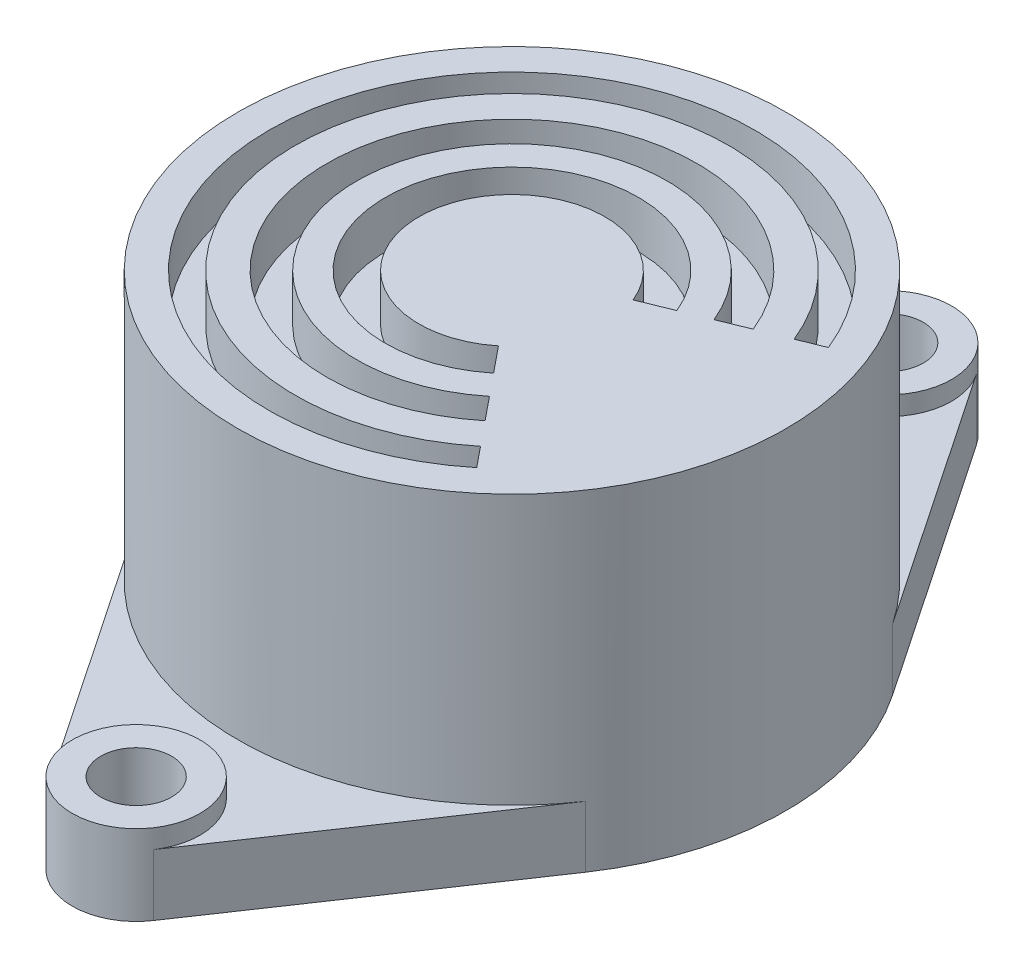
ISO-10303-21;
HEADER;
FILE_DESCRIPTION(('STEP AP214'),'2;1');
FILE_NAME('part.step','',(''),(''),'','','');
FILE_SCHEMA(('AUTOMOTIVE_DESIGN { 1 0 10303 214 1 1 1 1 }'));
ENDSEC;
DATA;
#1=APPLICATION_CONTEXT('core data for automotive mechanical design processes');
#2=APPLICATION_PROTOCOL_DEFINITION('international standard','automotive_design',2000,#1);
#3=PRODUCT_CONTEXT('',#1,'mechanical');
#4=PRODUCT('Part','Part','',(#3));
#5=PRODUCT_RELATED_PRODUCT_CATEGORY('part','',(#4));
#6=PRODUCT_DEFINITION_FORMATION('','',#4);
#7=PRODUCT_DEFINITION_CONTEXT('part definition',#1,'design');
#8=PRODUCT_DEFINITION('design','',#6,#7);
#9=PRODUCT_DEFINITION_SHAPE('','',#8);
#10=(LENGTH_UNIT() NAMED_UNIT(*) SI_UNIT(.MILLI.,.METRE.));
#11=(NAMED_UNIT(*) PLANE_ANGLE_UNIT() SI_UNIT($,.RADIAN.));
#12=(NAMED_UNIT(*) SI_UNIT($,.STERADIAN.) SOLID_ANGLE_UNIT());
#13=UNCERTAINTY_MEASURE_WITH_UNIT(LENGTH_MEASURE(1.E-05),#10,'distance_accuracy_value','');
#14=(GEOMETRIC_REPRESENTATION_CONTEXT(3) GLOBAL_UNCERTAINTY_ASSIGNED_CONTEXT((#13)) GLOBAL_UNIT_ASSIGNED_CONTEXT((#10,
#11,#12)) REPRESENTATION_CONTEXT('',''));
#15=CARTESIAN_POINT('',(0.,0.,0.));
#16=DIRECTION('',(0.,0.,1.));
#17=DIRECTION('',(1.,0.,0.));
#18=AXIS2_PLACEMENT_3D('',#15,#16,#17);
#19=CARTESIAN_POINT('',(0.,0.,0.));
#20=DIRECTION('',(0.,-1.,0.));
#21=DIRECTION('',(0.,0.,-1.));
#22=AXIS2_PLACEMENT_3D('',#19,#20,#21);
#23=PLANE('',#22);
#24=CARTESIAN_POINT('',(0.,0.,20.193));
#25=DIRECTION('',(0.,1.,0.));
#26=DIRECTION('',(0.,0.,1.));
#27=AXIS2_PLACEMENT_3D('',#24,#25,#26);
#28=CIRCLE('',#27,3.429);
#29=CARTESIAN_POINT('',(2.84148404108026,0.,22.1123773584906));
#30=VERTEX_POINT('',#29);
#31=CARTESIAN_POINT('',(-2.84148404108025,0.,22.1123773584906));
#32=VERTEX_POINT('',#31);
#33=EDGE_CURVE('E274',#30,#32,#28,.T.);
#34=ORIENTED_EDGE('',*,*,#33,.F.);
#35=DIRECTION('',(-0.559748427672956,0.,0.82866259582393));
#36=VECTOR('',#35,1.);
#37=CARTESIAN_POINT('',(12.2078573616781,0.,8.24621383647799));
#38=LINE('',#37,#36);
#39=CARTESIAN_POINT('',(12.2078573616781,0.,8.24621383647799));
#40=VERTEX_POINT('',#39);
#41=EDGE_CURVE('E293',#40,#30,#38,.T.);
#42=ORIENTED_EDGE('',*,*,#41,.F.);
#43=CARTESIAN_POINT('',(0.,0.,0.));
#44=DIRECTION('',(0.,1.,0.));
#45=DIRECTION('',(0.,0.,1.));
#46=AXIS2_PLACEMENT_3D('',#43,#44,#45);
#47=CIRCLE('',#46,14.732);
#48=CARTESIAN_POINT('',(-12.2078573616781,0.,8.24621383647799));
#49=VERTEX_POINT('',#48);
#50=EDGE_CURVE('E37',#49,#40,#47,.T.);
#51=ORIENTED_EDGE('',*,*,#50,.F.);
#52=DIRECTION('',(-0.559748427672956,0.,-0.82866259582393));
#53=VECTOR('',#52,1.);
#54=CARTESIAN_POINT('',(-2.84148404108025,0.,22.1123773584906));
#55=LINE('',#54,#53);
#56=EDGE_CURVE('E315',#32,#49,#55,.T.);
#57=ORIENTED_EDGE('',*,*,#56,.F.);
#58=EDGE_LOOP('',(#34,#42,#51,#57));
#59=FACE_BOUND('',#58,.T.);
#60=ADVANCED_FACE('F33',(#59),#23,.F.);
#61=CARTESIAN_POINT('',(0.,0.,-20.193));
#62=DIRECTION('',(0.,1.,0.));
#63=DIRECTION('',(0.,0.,1.));
#64=AXIS2_PLACEMENT_3D('',#61,#62,#63);
#65=CIRCLE('',#64,3.429);
#66=CARTESIAN_POINT('',(-2.84148404108025,0.,-22.1123773584906));
#67=VERTEX_POINT('',#66);
#68=CARTESIAN_POINT('',(2.84148404108026,0.,-22.1123773584906));
#69=VERTEX_POINT('',#68);
#70=EDGE_CURVE('E282',#67,#69,#65,.T.);
#71=ORIENTED_EDGE('',*,*,#70,.F.);
#72=DIRECTION('',(0.559748427672956,0.,-0.82866259582393));
#73=VECTOR('',#72,1.);
#74=CARTESIAN_POINT('',(-12.2078573616781,0.,-8.24621383647798));
#75=LINE('',#74,#73);
#76=CARTESIAN_POINT('',(-12.2078573616781,0.,-8.24621383647798));
#77=VERTEX_POINT('',#76);
#78=EDGE_CURVE('E318',#77,#67,#75,.T.);
#79=ORIENTED_EDGE('',*,*,#78,.F.);
#80=CARTESIAN_POINT('',(12.2078573616781,0.,-8.24621383647798));
#81=VERTEX_POINT('',#80);
#82=EDGE_CURVE('E42',#81,#77,#47,.T.);
#83=ORIENTED_EDGE('',*,*,#82,.F.);
#84=DIRECTION('',(0.559748427672956,0.,0.82866259582393));
#85=VECTOR('',#84,1.);
#86=CARTESIAN_POINT('',(2.84148404108026,0.,-22.1123773584906));
#87=LINE('',#86,#85);
#88=EDGE_CURVE('E298',#69,#81,#87,.T.);
#89=ORIENTED_EDGE('',*,*,#88,.F.);
#90=EDGE_LOOP('',(#71,#79,#83,#89));
#91=FACE_BOUND('',#90,.T.);
#92=ADVANCED_FACE('F357',(#91),#23,.F.);
#93=CARTESIAN_POINT('',(0.,14.478,0.));
#94=DIRECTION('',(0.,-1.,0.));
#95=DIRECTION('',(0.,0.,-1.));
#96=AXIS2_PLACEMENT_3D('',#93,#94,#95);
#97=CYLINDRICAL_SURFACE('',#96,14.732);
#98=CARTESIAN_POINT('',(0.,14.478,0.));
#99=DIRECTION('',(0.,1.,0.));
#100=DIRECTION('',(0.,0.,1.));
#101=AXIS2_PLACEMENT_3D('',#98,#99,#100);
#102=CIRCLE('',#101,14.732);
#103=CARTESIAN_POINT('',(0.,14.478,14.732));
#104=VERTEX_POINT('',#103);
#105=EDGE_CURVE('E11',#104,#104,#102,.T.);
#106=ORIENTED_EDGE('',*,*,#105,.F.);
#107=EDGE_LOOP('',(#106));
#108=FACE_BOUND('',#107,.T.);
#109=ORIENTED_EDGE('',*,*,#50,.T.);
#110=DIRECTION('',(0.,1.,0.));
#111=VECTOR('',#110,1.);
#112=CARTESIAN_POINT('',(12.2078573616781,-3.302,8.24621383647799));
#113=LINE('',#112,#111);
#114=CARTESIAN_POINT('',(12.2078573616781,-3.302,8.24621383647799));
#115=VERTEX_POINT('',#114);
#116=EDGE_CURVE('E342',#115,#40,#113,.T.);
#117=ORIENTED_EDGE('',*,*,#116,.F.);
#118=CARTESIAN_POINT('',(0.,-3.302,0.));
#119=DIRECTION('',(0.,-1.,0.));
#120=DIRECTION('',(0.,0.,-1.));
#121=AXIS2_PLACEMENT_3D('',#118,#119,#120);
#122=CIRCLE('',#121,14.732);
#123=CARTESIAN_POINT('',(12.2078573616781,-3.302,-8.24621383647798));
#124=VERTEX_POINT('',#123);
#125=EDGE_CURVE('E294',#124,#115,#122,.T.);
#126=ORIENTED_EDGE('',*,*,#125,.F.);
#127=DIRECTION('',(0.,1.,0.));
#128=VECTOR('',#127,1.);
#129=CARTESIAN_POINT('',(12.2078573616781,-3.302,-8.24621383647798));
#130=LINE('',#129,#128);
#131=EDGE_CURVE('E312',#124,#81,#130,.T.);
#132=ORIENTED_EDGE('',*,*,#131,.T.);
#133=ORIENTED_EDGE('',*,*,#82,.T.);
#134=DIRECTION('',(0.,1.,0.));
#135=VECTOR('',#134,1.);
#136=CARTESIAN_POINT('',(-12.2078573616781,-3.302,-8.24621383647798));
#137=LINE('',#136,#135);
#138=CARTESIAN_POINT('',(-12.2078573616781,-3.302,-8.24621383647798));
#139=VERTEX_POINT('',#138);
#140=EDGE_CURVE('E331',#139,#77,#137,.T.);
#141=ORIENTED_EDGE('',*,*,#140,.F.);
#142=CARTESIAN_POINT('',(0.,-3.302,0.));
#143=DIRECTION('',(0.,-1.,0.));
#144=DIRECTION('',(0.,0.,-1.));
#145=AXIS2_PLACEMENT_3D('',#142,#143,#144);
#146=CIRCLE('',#145,14.732);
#147=CARTESIAN_POINT('',(-12.2078573616781,-3.302,8.24621383647799));
#148=VERTEX_POINT('',#147);
#149=EDGE_CURVE('E304',#148,#139,#146,.T.);
#150=ORIENTED_EDGE('',*,*,#149,.F.);
#151=DIRECTION('',(0.,1.,0.));
#152=VECTOR('',#151,1.);
#153=CARTESIAN_POINT('',(-12.2078573616781,-3.302,8.24621383647799));
#154=LINE('',#153,#152);
#155=EDGE_CURVE('E333',#148,#49,#154,.T.);
#156=ORIENTED_EDGE('',*,*,#155,.T.);
#157=EDGE_LOOP('',(#109,#117,#126,#132,#133,#141,#150,#156));
#158=FACE_BOUND('',#157,.T.);
#159=ADVANCED_FACE('F35',(#108,#158),#97,.T.);
#160=CARTESIAN_POINT('',(0.,14.478,0.));
#161=DIRECTION('',(0.,1.,0.));
#162=DIRECTION('',(0.,0.,1.));
#163=AXIS2_PLACEMENT_3D('',#160,#161,#162);
#164=PLANE('',#163);
#165=CARTESIAN_POINT('',(0.,14.478,0.));
#166=DIRECTION('',(0.,1.,0.));
#167=DIRECTION('',(0.,0.,1.));
#168=AXIS2_PLACEMENT_3D('',#165,#166,#167);
#169=CIRCLE('',#168,9.95078516740191);
#170=CARTESIAN_POINT('',(9.21915196110547,14.478,-3.74504506859813));
#171=VERTEX_POINT('',#170);
#172=CARTESIAN_POINT('',(6.2771975329455,14.478,7.72106965259146));
#173=VERTEX_POINT('',#172);
#174=EDGE_CURVE('E49',#171,#173,#169,.T.);
#175=ORIENTED_EDGE('',*,*,#174,.F.);
#176=DIRECTION('',(0.926474826459602,0.,-0.376356740256702));
#177=VECTOR('',#176,1.);
#178=CARTESIAN_POINT('',(7.7212581162723,14.478,-3.13656394359417));
#179=LINE('',#178,#177);
#180=CARTESIAN_POINT('',(7.7212581162723,14.478,-3.13656394359417));
#181=VERTEX_POINT('',#180);
#182=EDGE_CURVE('E213',#181,#171,#179,.T.);
#183=ORIENTED_EDGE('',*,*,#182,.F.);
#184=CARTESIAN_POINT('',(0.,14.478,0.));
#185=DIRECTION('',(0.,-1.,0.));
#186=DIRECTION('',(0.,0.,1.));
#187=AXIS2_PLACEMENT_3D('',#184,#185,#186);
#188=CIRCLE('',#187,8.33401825474098);
#189=CARTESIAN_POINT('',(5.25730160465738,14.478,6.46657870191208));
#190=VERTEX_POINT('',#189);
#191=EDGE_CURVE('E227',#190,#181,#188,.T.);
#192=ORIENTED_EDGE('',*,*,#191,.F.);
#193=DIRECTION('',(-0.630824344747103,0.,-0.775925670457157));
#194=VECTOR('',#193,1.);
#195=CARTESIAN_POINT('',(5.25730160465738,14.478,6.46657870191208));
#196=LINE('',#195,#194);
#197=EDGE_CURVE('E224',#173,#190,#196,.T.);
#198=ORIENTED_EDGE('',*,*,#197,.F.);
#199=EDGE_LOOP('',(#175,#183,#192,#198));
#200=FACE_BOUND('',#199,.T.);
#201=CARTESIAN_POINT('',(0.,14.478,0.));
#202=DIRECTION('',(0.,1.,0.));
#203=DIRECTION('',(0.,0.,1.));
#204=AXIS2_PLACEMENT_3D('',#201,#202,#203);
#205=CIRCLE('',#204,6.79910263736459);
#206=CARTESIAN_POINT('',(6.29919743603338,14.478,-2.55888810526929));
#207=VERTEX_POINT('',#206);
#208=CARTESIAN_POINT('',(4.28903946608382,14.478,5.27559827240414));
#209=VERTEX_POINT('',#208);
#210=EDGE_CURVE('E57',#207,#209,#205,.T.);
#211=ORIENTED_EDGE('',*,*,#210,.F.);
#212=DIRECTION('',(0.926474826459602,0.,-0.376356740256702));
#213=VECTOR('',#212,1.);
#214=CARTESIAN_POINT('',(4.62736621196091,14.478,-1.87974936152629));
#215=LINE('',#214,#213);
#216=CARTESIAN_POINT('',(4.62736621196091,14.478,-1.87974936152629));
#217=VERTEX_POINT('',#216);
#218=EDGE_CURVE('E191',#217,#207,#215,.T.);
#219=ORIENTED_EDGE('',*,*,#218,.F.);
#220=CARTESIAN_POINT('',(0.,14.478,0.));
#221=DIRECTION('',(0.,-1.,0.));
#222=DIRECTION('',(0.,0.,1.));
#223=AXIS2_PLACEMENT_3D('',#220,#221,#222);
#224=CIRCLE('',#223,4.99459465039516);
#225=CARTESIAN_POINT('',(3.15071189761292,14.478,3.87543420276959));
#226=VERTEX_POINT('',#225);
#227=EDGE_CURVE('E194',#226,#217,#224,.T.);
#228=ORIENTED_EDGE('',*,*,#227,.F.);
#229=DIRECTION('',(-0.630824344747103,0.,-0.775925670457156));
#230=VECTOR('',#229,1.);
#231=CARTESIAN_POINT('',(3.15071189761292,14.478,3.87543420276959));
#232=LINE('',#231,#230);
#233=EDGE_CURVE('E200',#209,#226,#232,.T.);
#234=ORIENTED_EDGE('',*,*,#233,.F.);
#235=EDGE_LOOP('',(#211,#219,#228,#234));
#236=FACE_BOUND('',#235,.T.);
#237=CARTESIAN_POINT('',(0.,14.478,0.));
#238=DIRECTION('',(0.,-1.,0.));
#239=DIRECTION('',(0.,0.,1.));
#240=AXIS2_PLACEMENT_3D('',#237,#238,#239);
#241=CIRCLE('',#240,11.6398044373825);
#242=CARTESIAN_POINT('',(7.34267200719623,14.478,9.03162306206618));
#243=VERTEX_POINT('',#242);
#244=CARTESIAN_POINT('',(10.7839857961476,14.478,-4.38071885527876));
#245=VERTEX_POINT('',#244);
#246=EDGE_CURVE('E234',#243,#245,#241,.T.);
#247=ORIENTED_EDGE('',*,*,#246,.F.);
#248=DIRECTION('',(-0.630824344747104,0.,-0.775925670457156));
#249=VECTOR('',#248,1.);
#250=CARTESIAN_POINT('',(7.34267200719623,14.478,9.03162306206618));
#251=LINE('',#250,#249);
#252=CARTESIAN_POINT('',(8.2338497940651,14.478,10.1277883060534));
#253=VERTEX_POINT('',#252);
#254=EDGE_CURVE('E244',#253,#243,#251,.T.);
#255=ORIENTED_EDGE('',*,*,#254,.F.);
#256=CARTESIAN_POINT('',(0.,14.478,0.));
#257=DIRECTION('',(0.,1.,0.));
#258=DIRECTION('',(0.,0.,1.));
#259=AXIS2_PLACEMENT_3D('',#256,#257,#258);
#260=CIRCLE('',#259,13.0525238327098);
#261=CARTESIAN_POINT('',(12.0928347527696,14.478,-4.91240532180158));
#262=VERTEX_POINT('',#261);
#263=EDGE_CURVE('E258',#262,#253,#260,.T.);
#264=ORIENTED_EDGE('',*,*,#263,.F.);
#265=DIRECTION('',(0.926474826459602,0.,-0.376356740256702));
#266=VECTOR('',#265,1.);
#267=CARTESIAN_POINT('',(10.7839857961476,14.478,-4.38071885527877));
#268=LINE('',#267,#266);
#269=EDGE_CURVE('E255',#245,#262,#268,.T.);
#270=ORIENTED_EDGE('',*,*,#269,.F.);
#271=EDGE_LOOP('',(#247,#255,#264,#270));
#272=FACE_BOUND('',#271,.T.);
#273=ORIENTED_EDGE('',*,*,#105,.T.);
#274=EDGE_LOOP('',(#273));
#275=FACE_BOUND('',#274,.T.);
#276=ADVANCED_FACE('F427',(#200,#236,#272,#275),#164,.T.);
#277=CARTESIAN_POINT('',(0.,-3.302,0.));
#278=DIRECTION('',(0.,-1.,0.));
#279=DIRECTION('',(0.,0.,-1.));
#280=AXIS2_PLACEMENT_3D('',#277,#278,#279);
#281=PLANE('',#280);
#282=CARTESIAN_POINT('',(0.,-3.302,-20.193));
#283=DIRECTION('',(0.,-1.,0.));
#284=DIRECTION('',(0.,0.,-1.));
#285=AXIS2_PLACEMENT_3D('',#282,#283,#284);
#286=CIRCLE('',#285,1.905);
#287=CARTESIAN_POINT('',(0.,-3.302,-18.288));
#288=VERTEX_POINT('',#287);
#289=EDGE_CURVE('E290',#288,#288,#286,.T.);
#290=ORIENTED_EDGE('',*,*,#289,.F.);
#291=EDGE_LOOP('',(#290));
#292=FACE_BOUND('',#291,.T.);
#293=ORIENTED_EDGE('',*,*,#125,.T.);
#294=DIRECTION('',(-0.559748427672956,0.,0.82866259582393));
#295=VECTOR('',#294,1.);
#296=CARTESIAN_POINT('',(12.2078573616781,-3.302,8.24621383647799));
#297=LINE('',#296,#295);
#298=CARTESIAN_POINT('',(2.84148404108026,-3.302,22.1123773584906));
#299=VERTEX_POINT('',#298);
#300=EDGE_CURVE('E297',#115,#299,#297,.T.);
#301=ORIENTED_EDGE('',*,*,#300,.T.);
#302=CARTESIAN_POINT('',(0.,-3.302,20.193));
#303=DIRECTION('',(0.,-1.,0.));
#304=DIRECTION('',(0.,0.,-1.));
#305=AXIS2_PLACEMENT_3D('',#302,#303,#304);
#306=CIRCLE('',#305,3.429);
#307=CARTESIAN_POINT('',(-2.84148404108025,-3.302,22.1123773584906));
#308=VERTEX_POINT('',#307);
#309=EDGE_CURVE('E300',#299,#308,#306,.T.);
#310=ORIENTED_EDGE('',*,*,#309,.T.);
#311=DIRECTION('',(-0.559748427672956,0.,-0.82866259582393));
#312=VECTOR('',#311,1.);
#313=CARTESIAN_POINT('',(-2.84148404108025,-3.302,22.1123773584906));
#314=LINE('',#313,#312);
#315=EDGE_CURVE('E302',#308,#148,#314,.T.);
#316=ORIENTED_EDGE('',*,*,#315,.T.);
#317=ORIENTED_EDGE('',*,*,#149,.T.);
#318=DIRECTION('',(0.559748427672956,0.,-0.82866259582393));
#319=VECTOR('',#318,1.);
#320=CARTESIAN_POINT('',(-12.2078573616781,-3.302,-8.24621383647798));
#321=LINE('',#320,#319);
#322=CARTESIAN_POINT('',(-2.84148404108025,-3.302,-22.1123773584906));
#323=VERTEX_POINT('',#322);
#324=EDGE_CURVE('E306',#139,#323,#321,.T.);
#325=ORIENTED_EDGE('',*,*,#324,.T.);
#326=CARTESIAN_POINT('',(0.,-3.302,-20.193));
#327=DIRECTION('',(0.,-1.,0.));
#328=DIRECTION('',(0.,0.,-1.));
#329=AXIS2_PLACEMENT_3D('',#326,#327,#328);
#330=CIRCLE('',#329,3.429);
#331=CARTESIAN_POINT('',(2.84148404108026,-3.302,-22.1123773584906));
#332=VERTEX_POINT('',#331);
#333=EDGE_CURVE('E308',#323,#332,#330,.T.);
#334=ORIENTED_EDGE('',*,*,#333,.T.);
#335=DIRECTION('',(0.559748427672956,0.,0.82866259582393));
#336=VECTOR('',#335,1.);
#337=CARTESIAN_POINT('',(2.84148404108026,-3.302,-22.1123773584906));
#338=LINE('',#337,#336);
#339=EDGE_CURVE('E310',#332,#124,#338,.T.);
#340=ORIENTED_EDGE('',*,*,#339,.T.);
#341=EDGE_LOOP('',(#293,#301,#310,#316,#317,#325,#334,#340));
#342=FACE_BOUND('',#341,.T.);
#343=CARTESIAN_POINT('',(0.,-3.302,20.193));
#344=DIRECTION('',(0.,-1.,0.));
#345=DIRECTION('',(0.,0.,-1.));
#346=AXIS2_PLACEMENT_3D('',#343,#344,#345);
#347=CIRCLE('',#346,1.905);
#348=CARTESIAN_POINT('',(0.,-3.302,22.098));
#349=VERTEX_POINT('',#348);
#350=EDGE_CURVE('E286',#349,#349,#347,.T.);
#351=ORIENTED_EDGE('',*,*,#350,.F.);
#352=EDGE_LOOP('',(#351));
#353=FACE_BOUND('',#352,.T.);
#354=ADVANCED_FACE('F370',(#292,#342,#353),#281,.T.);
#355=CARTESIAN_POINT('',(12.2078573616781,-3.302,8.24621383647799));
#356=DIRECTION('',(-0.82866259582393,0.,-0.559748427672956));
#357=DIRECTION('',(-0.559748427672956,0.,0.82866259582393));
#358=AXIS2_PLACEMENT_3D('',#355,#356,#357);
#359=PLANE('',#358);
#360=ORIENTED_EDGE('',*,*,#41,.T.);
#361=DIRECTION('',(0.,1.,0.));
#362=VECTOR('',#361,1.);
#363=CARTESIAN_POINT('',(2.84148404108026,-3.302,22.1123773584906));
#364=LINE('',#363,#362);
#365=EDGE_CURVE('E339',#299,#30,#364,.T.);
#366=ORIENTED_EDGE('',*,*,#365,.F.);
#367=ORIENTED_EDGE('',*,*,#300,.F.);
#368=ORIENTED_EDGE('',*,*,#116,.T.);
#369=EDGE_LOOP('',(#360,#366,#367,#368));
#370=FACE_BOUND('',#369,.T.);
#371=ADVANCED_FACE('F380',(#370),#359,.F.);
#372=CARTESIAN_POINT('',(0.,-3.302,20.193));
#373=DIRECTION('',(0.,1.,0.));
#374=DIRECTION('',(0.,0.,1.));
#375=AXIS2_PLACEMENT_3D('',#372,#373,#374);
#376=CYLINDRICAL_SURFACE('',#375,3.429);
#377=ORIENTED_EDGE('',*,*,#365,.T.);
#378=ORIENTED_EDGE('',*,*,#33,.T.);
#379=DIRECTION('',(0.,1.,0.));
#380=VECTOR('',#379,1.);
#381=CARTESIAN_POINT('',(-2.84148404108025,-3.302,22.1123773584906));
#382=LINE('',#381,#380);
#383=EDGE_CURVE('E336',#308,#32,#382,.T.);
#384=ORIENTED_EDGE('',*,*,#383,.F.);
#385=ORIENTED_EDGE('',*,*,#309,.F.);
#386=EDGE_LOOP('',(#377,#378,#384,#385));
#387=FACE_BOUND('',#386,.T.);
#388=CARTESIAN_POINT('',(0.,1.016,20.193));
#389=DIRECTION('',(0.,1.,0.));
#390=DIRECTION('',(0.,0.,1.));
#391=AXIS2_PLACEMENT_3D('',#388,#389,#390);
#392=CIRCLE('',#391,3.429);
#393=CARTESIAN_POINT('',(0.,1.016,23.622));
#394=VERTEX_POINT('',#393);
#395=EDGE_CURVE('E275',#394,#394,#392,.T.);
#396=ORIENTED_EDGE('',*,*,#395,.F.);
#397=EDGE_LOOP('',(#396));
#398=FACE_BOUND('',#397,.T.);
#399=ADVANCED_FACE('F383',(#387,#398),#376,.T.);
#400=CARTESIAN_POINT('',(-2.84148404108025,-3.302,22.1123773584906));
#401=DIRECTION('',(0.82866259582393,0.,-0.559748427672956));
#402=DIRECTION('',(-0.559748427672956,0.,-0.82866259582393));
#403=AXIS2_PLACEMENT_3D('',#400,#401,#402);
#404=PLANE('',#403);
#405=ORIENTED_EDGE('',*,*,#56,.T.);
#406=ORIENTED_EDGE('',*,*,#155,.F.);
#407=ORIENTED_EDGE('',*,*,#315,.F.);
#408=ORIENTED_EDGE('',*,*,#383,.T.);
#409=EDGE_LOOP('',(#405,#406,#407,#408));
#410=FACE_BOUND('',#409,.T.);
#411=ADVANCED_FACE('F375',(#410),#404,.F.);
#412=CARTESIAN_POINT('',(-12.2078573616781,-3.302,-8.24621383647798));
#413=DIRECTION('',(0.82866259582393,0.,0.559748427672956));
#414=DIRECTION('',(0.559748427672956,0.,-0.82866259582393));
#415=AXIS2_PLACEMENT_3D('',#412,#413,#414);
#416=PLANE('',#415);
#417=ORIENTED_EDGE('',*,*,#78,.T.);
#418=DIRECTION('',(0.,1.,0.));
#419=VECTOR('',#418,1.);
#420=CARTESIAN_POINT('',(-2.84148404108025,-3.302,-22.1123773584906));
#421=LINE('',#420,#419);
#422=EDGE_CURVE('E328',#323,#67,#421,.T.);
#423=ORIENTED_EDGE('',*,*,#422,.F.);
#424=ORIENTED_EDGE('',*,*,#324,.F.);
#425=ORIENTED_EDGE('',*,*,#140,.T.);
#426=EDGE_LOOP('',(#417,#423,#424,#425));
#427=FACE_BOUND('',#426,.T.);
#428=ADVANCED_FACE('F368',(#427),#416,.F.);
#429=CARTESIAN_POINT('',(0.,-3.302,-20.193));
#430=DIRECTION('',(0.,1.,0.));
#431=DIRECTION('',(0.,0.,1.));
#432=AXIS2_PLACEMENT_3D('',#429,#430,#431);
#433=CYLINDRICAL_SURFACE('',#432,3.429);
#434=ORIENTED_EDGE('',*,*,#422,.T.);
#435=ORIENTED_EDGE('',*,*,#70,.T.);
#436=DIRECTION('',(0.,1.,0.));
#437=VECTOR('',#436,1.);
#438=CARTESIAN_POINT('',(2.84148404108026,-3.302,-22.1123773584906));
#439=LINE('',#438,#437);
#440=EDGE_CURVE('E325',#332,#69,#439,.T.);
#441=ORIENTED_EDGE('',*,*,#440,.F.);
#442=ORIENTED_EDGE('',*,*,#333,.F.);
#443=EDGE_LOOP('',(#434,#435,#441,#442));
#444=FACE_BOUND('',#443,.T.);
#445=CARTESIAN_POINT('',(0.,1.016,-20.193));
#446=DIRECTION('',(0.,1.,0.));
#447=DIRECTION('',(0.,0.,1.));
#448=AXIS2_PLACEMENT_3D('',#445,#446,#447);
#449=CIRCLE('',#448,3.429);
#450=CARTESIAN_POINT('',(0.,1.016,-16.764));
#451=VERTEX_POINT('',#450);
#452=EDGE_CURVE('E283',#451,#451,#449,.T.);
#453=ORIENTED_EDGE('',*,*,#452,.F.);
#454=EDGE_LOOP('',(#453));
#455=FACE_BOUND('',#454,.T.);
#456=ADVANCED_FACE('F364',(#444,#455),#433,.T.);
#457=CARTESIAN_POINT('',(2.84148404108026,-3.302,-22.1123773584906));
#458=DIRECTION('',(-0.82866259582393,0.,0.559748427672955));
#459=DIRECTION('',(0.559748427672956,0.,0.82866259582393));
#460=AXIS2_PLACEMENT_3D('',#457,#458,#459);
#461=PLANE('',#460);
#462=ORIENTED_EDGE('',*,*,#88,.T.);
#463=ORIENTED_EDGE('',*,*,#131,.F.);
#464=ORIENTED_EDGE('',*,*,#339,.F.);
#465=ORIENTED_EDGE('',*,*,#440,.T.);
#466=EDGE_LOOP('',(#462,#463,#464,#465));
#467=FACE_BOUND('',#466,.T.);
#468=ADVANCED_FACE('F359',(#467),#461,.F.);
#469=CARTESIAN_POINT('',(0.,-3.302,-20.193));
#470=DIRECTION('',(0.,1.,0.));
#471=DIRECTION('',(0.,0.,1.));
#472=AXIS2_PLACEMENT_3D('',#469,#470,#471);
#473=CYLINDRICAL_SURFACE('',#472,1.905);
#474=CARTESIAN_POINT('',(0.,1.016,-20.193));
#475=DIRECTION('',(0.,1.,0.));
#476=DIRECTION('',(0.,0.,1.));
#477=AXIS2_PLACEMENT_3D('',#474,#475,#476);
#478=CIRCLE('',#477,1.905);
#479=CARTESIAN_POINT('',(0.,1.016,-18.288));
#480=VERTEX_POINT('',#479);
#481=EDGE_CURVE('E278',#480,#480,#478,.T.);
#482=CARTESIAN_POINT('',(0.,-3.302,-18.288));
#483=CARTESIAN_POINT('',(0.,-3.25702083333333,-18.288));
#484=CARTESIAN_POINT('',(0.,-3.21204166666667,-18.288));
#485=CARTESIAN_POINT('',(0.,-3.12208333333333,-18.288));
#486=CARTESIAN_POINT('',(0.,-3.07710416666667,-18.288));
#487=CARTESIAN_POINT('',(0.,-2.98714583333333,-18.288));
#488=CARTESIAN_POINT('',(0.,-2.94216666666667,-18.288));
#489=CARTESIAN_POINT('',(0.,-2.85220833333333,-18.288));
#490=CARTESIAN_POINT('',(0.,-2.80722916666667,-18.288));
#491=CARTESIAN_POINT('',(0.,-2.71727083333333,-18.288));
#492=CARTESIAN_POINT('',(0.,-2.67229166666667,-18.288));
#493=CARTESIAN_POINT('',(0.,-2.58233333333333,-18.288));
#494=CARTESIAN_POINT('',(0.,-2.53735416666667,-18.288));
#495=CARTESIAN_POINT('',(0.,-2.44739583333333,-18.288));
#496=CARTESIAN_POINT('',(0.,-2.40241666666667,-18.288));
#497=CARTESIAN_POINT('',(0.,-2.31245833333333,-18.288));
#498=CARTESIAN_POINT('',(0.,-2.26747916666667,-18.288));
#499=CARTESIAN_POINT('',(0.,-2.17752083333333,-18.288));
#500=CARTESIAN_POINT('',(0.,-2.13254166666667,-18.288));
#501=CARTESIAN_POINT('',(0.,-2.04258333333333,-18.288));
#502=CARTESIAN_POINT('',(0.,-1.99760416666667,-18.288));
#503=CARTESIAN_POINT('',(0.,-1.90764583333333,-18.288));
#504=CARTESIAN_POINT('',(0.,-1.86266666666667,-18.288));
#505=CARTESIAN_POINT('',(0.,-1.77270833333333,-18.288));
#506=CARTESIAN_POINT('',(0.,-1.72772916666667,-18.288));
#507=CARTESIAN_POINT('',(0.,-1.63777083333333,-18.288));
#508=CARTESIAN_POINT('',(0.,-1.59279166666667,-18.288));
#509=CARTESIAN_POINT('',(0.,-1.50283333333333,-18.288));
#510=CARTESIAN_POINT('',(0.,-1.45785416666667,-18.288));
#511=CARTESIAN_POINT('',(0.,-1.36789583333333,-18.288));
#512=CARTESIAN_POINT('',(0.,-1.32291666666667,-18.288));
#513=CARTESIAN_POINT('',(0.,-1.23295833333333,-18.288));
#514=CARTESIAN_POINT('',(0.,-1.18797916666667,-18.288));
#515=CARTESIAN_POINT('',(0.,-1.09802083333333,-18.288));
#516=CARTESIAN_POINT('',(0.,-1.05304166666667,-18.288));
#517=CARTESIAN_POINT('',(0.,-0.963083333333333,-18.288));
#518=CARTESIAN_POINT('',(0.,-0.918104166666666,-18.288));
#519=CARTESIAN_POINT('',(0.,-0.828145833333333,-18.288));
#520=CARTESIAN_POINT('',(0.,-0.783166666666666,-18.288));
#521=CARTESIAN_POINT('',(0.,-0.693208333333333,-18.288));
#522=CARTESIAN_POINT('',(0.,-0.648229166666666,-18.288));
#523=CARTESIAN_POINT('',(0.,-0.558270833333333,-18.288));
#524=CARTESIAN_POINT('',(0.,-0.513291666666667,-18.288));
#525=CARTESIAN_POINT('',(0.,-0.423333333333333,-18.288));
#526=CARTESIAN_POINT('',(0.,-0.378354166666667,-18.288));
#527=CARTESIAN_POINT('',(0.,-0.288395833333333,-18.288));
#528=CARTESIAN_POINT('',(0.,-0.243416666666667,-18.288));
#529=CARTESIAN_POINT('',(0.,-0.153458333333333,-18.288));
#530=CARTESIAN_POINT('',(0.,-0.108479166666666,-18.288));
#531=CARTESIAN_POINT('',(0.,-0.0185208333333331,-18.288));
#532=CARTESIAN_POINT('',(0.,0.0264583333333336,-18.288));
#533=CARTESIAN_POINT('',(0.,0.116416666666667,-18.288));
#534=CARTESIAN_POINT('',(0.,0.161395833333334,-18.288));
#535=CARTESIAN_POINT('',(0.,0.251354166666667,-18.288));
#536=CARTESIAN_POINT('',(0.,0.296333333333334,-18.288));
#537=CARTESIAN_POINT('',(0.,0.386291666666667,-18.288));
#538=CARTESIAN_POINT('',(0.,0.431270833333334,-18.288));
#539=CARTESIAN_POINT('',(0.,0.521229166666667,-18.288));
#540=CARTESIAN_POINT('',(0.,0.566208333333334,-18.288));
#541=CARTESIAN_POINT('',(0.,0.656166666666667,-18.288));
#542=CARTESIAN_POINT('',(0.,0.701145833333333,-18.288));
#543=CARTESIAN_POINT('',(0.,0.791104166666667,-18.288));
#544=CARTESIAN_POINT('',(0.,0.836083333333334,-18.288));
#545=CARTESIAN_POINT('',(0.,0.926041666666667,-18.288));
#546=CARTESIAN_POINT('',(0.,0.971020833333334,-18.288));
#547=CARTESIAN_POINT('',(0.,1.016,-18.288));
#548=B_SPLINE_CURVE_WITH_KNOTS('',3,(#482,#483,#484,#485,#486,#487,#488,#489,#490,#491,#492,
#493,#494,#495,#496,#497,#498,#499,#500,#501,#502,#503,#504,#505,#506,#507,#508,#509,#510,#511,
#512,#513,#514,#515,#516,#517,#518,#519,#520,#521,#522,#523,#524,#525,#526,#527,#528,#529,#530,
#531,#532,#533,#534,#535,#536,#537,#538,#539,#540,#541,#542,#543,#544,#545,#546,#547),
.UNSPECIFIED.,.F.,.F.,(4,2,2,2,2,2,2,2,2,2,2,2,2,2,2,2,2,2,2,2,2,2,2,2,2,2,2,2,2,2,2,2,4),(0.,
0.1349375,0.269875,0.4048125,0.53975,0.6746875,0.809625,0.9445625,1.0795,1.2144375,1.349375,
1.4843125,1.61925,1.7541875,1.889125,2.0240625,2.159,2.2939375,2.428875,2.5638125,2.69875,
2.8336875,2.968625,3.1035625,3.2385,3.3734375,3.508375,3.6433125,3.77825,3.9131875,4.048125,
4.1830625,4.318),.UNSPECIFIED.);
#549=EDGE_CURVE('BSEAM399',#288,#480,#548,.T.);
#550=ORIENTED_EDGE('',*,*,#289,.T.);
#551=ORIENTED_EDGE('',*,*,#481,.T.);
#552=ORIENTED_EDGE('',*,*,#549,.T.);
#553=ORIENTED_EDGE('',*,*,#549,.F.);
#554=EDGE_LOOP('',(#550,#552,#551,#553));
#555=FACE_BOUND('',#554,.T.);
#556=ADVANCED_FACE('F399',(#555),#473,.F.);
#557=CARTESIAN_POINT('',(0.,-3.302,20.193));
#558=DIRECTION('',(0.,1.,0.));
#559=DIRECTION('',(0.,0.,1.));
#560=AXIS2_PLACEMENT_3D('',#557,#558,#559);
#561=CYLINDRICAL_SURFACE('',#560,1.905);
#562=CARTESIAN_POINT('',(0.,1.016,20.193));
#563=DIRECTION('',(0.,1.,0.));
#564=DIRECTION('',(0.,0.,1.));
#565=AXIS2_PLACEMENT_3D('',#562,#563,#564);
#566=CIRCLE('',#565,1.905);
#567=CARTESIAN_POINT('',(0.,1.016,22.098));
#568=VERTEX_POINT('',#567);
#569=EDGE_CURVE('E265',#568,#568,#566,.T.);
#570=CARTESIAN_POINT('',(0.,-3.302,22.098));
#571=CARTESIAN_POINT('',(0.,-3.25702083333333,22.098));
#572=CARTESIAN_POINT('',(0.,-3.21204166666667,22.098));
#573=CARTESIAN_POINT('',(0.,-3.12208333333333,22.098));
#574=CARTESIAN_POINT('',(0.,-3.07710416666667,22.098));
#575=CARTESIAN_POINT('',(0.,-2.98714583333333,22.098));
#576=CARTESIAN_POINT('',(0.,-2.94216666666667,22.098));
#577=CARTESIAN_POINT('',(0.,-2.85220833333333,22.098));
#578=CARTESIAN_POINT('',(0.,-2.80722916666667,22.098));
#579=CARTESIAN_POINT('',(0.,-2.71727083333333,22.098));
#580=CARTESIAN_POINT('',(0.,-2.67229166666667,22.098));
#581=CARTESIAN_POINT('',(0.,-2.58233333333333,22.098));
#582=CARTESIAN_POINT('',(0.,-2.53735416666667,22.098));
#583=CARTESIAN_POINT('',(0.,-2.44739583333333,22.098));
#584=CARTESIAN_POINT('',(0.,-2.40241666666667,22.098));
#585=CARTESIAN_POINT('',(0.,-2.31245833333333,22.098));
#586=CARTESIAN_POINT('',(0.,-2.26747916666667,22.098));
#587=CARTESIAN_POINT('',(0.,-2.17752083333333,22.098));
#588=CARTESIAN_POINT('',(0.,-2.13254166666667,22.098));
#589=CARTESIAN_POINT('',(0.,-2.04258333333333,22.098));
#590=CARTESIAN_POINT('',(0.,-1.99760416666667,22.098));
#591=CARTESIAN_POINT('',(0.,-1.90764583333333,22.098));
#592=CARTESIAN_POINT('',(0.,-1.86266666666667,22.098));
#593=CARTESIAN_POINT('',(0.,-1.77270833333333,22.098));
#594=CARTESIAN_POINT('',(0.,-1.72772916666667,22.098));
#595=CARTESIAN_POINT('',(0.,-1.63777083333333,22.098));
#596=CARTESIAN_POINT('',(0.,-1.59279166666667,22.098));
#597=CARTESIAN_POINT('',(0.,-1.50283333333333,22.098));
#598=CARTESIAN_POINT('',(0.,-1.45785416666667,22.098));
#599=CARTESIAN_POINT('',(0.,-1.36789583333333,22.098));
#600=CARTESIAN_POINT('',(0.,-1.32291666666667,22.098));
#601=CARTESIAN_POINT('',(0.,-1.23295833333333,22.098));
#602=CARTESIAN_POINT('',(0.,-1.18797916666667,22.098));
#603=CARTESIAN_POINT('',(0.,-1.09802083333333,22.098));
#604=CARTESIAN_POINT('',(0.,-1.05304166666667,22.098));
#605=CARTESIAN_POINT('',(0.,-0.963083333333333,22.098));
#606=CARTESIAN_POINT('',(0.,-0.918104166666666,22.098));
#607=CARTESIAN_POINT('',(0.,-0.828145833333333,22.098));
#608=CARTESIAN_POINT('',(0.,-0.783166666666666,22.098));
#609=CARTESIAN_POINT('',(0.,-0.693208333333333,22.098));
#610=CARTESIAN_POINT('',(0.,-0.648229166666666,22.098));
#611=CARTESIAN_POINT('',(0.,-0.558270833333333,22.098));
#612=CARTESIAN_POINT('',(0.,-0.513291666666667,22.098));
#613=CARTESIAN_POINT('',(0.,-0.423333333333333,22.098));
#614=CARTESIAN_POINT('',(0.,-0.378354166666667,22.098));
#615=CARTESIAN_POINT('',(0.,-0.288395833333333,22.098));
#616=CARTESIAN_POINT('',(0.,-0.243416666666667,22.098));
#617=CARTESIAN_POINT('',(0.,-0.153458333333333,22.098));
#618=CARTESIAN_POINT('',(0.,-0.108479166666666,22.098));
#619=CARTESIAN_POINT('',(0.,-0.0185208333333331,22.098));
#620=CARTESIAN_POINT('',(0.,0.0264583333333336,22.098));
#621=CARTESIAN_POINT('',(0.,0.116416666666667,22.098));
#622=CARTESIAN_POINT('',(0.,0.161395833333334,22.098));
#623=CARTESIAN_POINT('',(0.,0.251354166666667,22.098));
#624=CARTESIAN_POINT('',(0.,0.296333333333334,22.098));
#625=CARTESIAN_POINT('',(0.,0.386291666666667,22.098));
#626=CARTESIAN_POINT('',(0.,0.431270833333334,22.098));
#627=CARTESIAN_POINT('',(0.,0.521229166666667,22.098));
#628=CARTESIAN_POINT('',(0.,0.566208333333334,22.098));
#629=CARTESIAN_POINT('',(0.,0.656166666666667,22.098));
#630=CARTESIAN_POINT('',(0.,0.701145833333333,22.098));
#631=CARTESIAN_POINT('',(0.,0.791104166666667,22.098));
#632=CARTESIAN_POINT('',(0.,0.836083333333334,22.098));
#633=CARTESIAN_POINT('',(0.,0.926041666666667,22.098));
#634=CARTESIAN_POINT('',(0.,0.971020833333334,22.098));
#635=CARTESIAN_POINT('',(0.,1.016,22.098));
#636=B_SPLINE_CURVE_WITH_KNOTS('',3,(#570,#571,#572,#573,#574,#575,#576,#577,#578,#579,#580,
#581,#582,#583,#584,#585,#586,#587,#588,#589,#590,#591,#592,#593,#594,#595,#596,#597,#598,#599,
#600,#601,#602,#603,#604,#605,#606,#607,#608,#609,#610,#611,#612,#613,#614,#615,#616,#617,#618,
#619,#620,#621,#622,#623,#624,#625,#626,#627,#628,#629,#630,#631,#632,#633,#634,#635),
.UNSPECIFIED.,.F.,.F.,(4,2,2,2,2,2,2,2,2,2,2,2,2,2,2,2,2,2,2,2,2,2,2,2,2,2,2,2,2,2,2,2,4),(0.,
0.1349375,0.269875,0.4048125,0.53975,0.6746875,0.809625,0.9445625,1.0795,1.2144375,1.349375,
1.4843125,1.61925,1.7541875,1.889125,2.0240625,2.159,2.2939375,2.428875,2.5638125,2.69875,
2.8336875,2.968625,3.1035625,3.2385,3.3734375,3.508375,3.6433125,3.77825,3.9131875,4.048125,
4.1830625,4.318),.UNSPECIFIED.);
#637=EDGE_CURVE('BSEAM397',#349,#568,#636,.T.);
#638=ORIENTED_EDGE('',*,*,#350,.T.);
#639=ORIENTED_EDGE('',*,*,#569,.T.);
#640=ORIENTED_EDGE('',*,*,#637,.T.);
#641=ORIENTED_EDGE('',*,*,#637,.F.);
#642=EDGE_LOOP('',(#638,#640,#639,#641));
#643=FACE_BOUND('',#642,.T.);
#644=ADVANCED_FACE('F397',(#643),#561,.F.);
#645=CARTESIAN_POINT('',(0.,1.016,-20.193));
#646=DIRECTION('',(0.,1.,0.));
#647=DIRECTION('',(0.,0.,1.));
#648=AXIS2_PLACEMENT_3D('',#645,#646,#647);
#649=PLANE('',#648);
#650=ORIENTED_EDGE('',*,*,#452,.T.);
#651=EDGE_LOOP('',(#650));
#652=FACE_BOUND('',#651,.T.);
#653=ORIENTED_EDGE('',*,*,#481,.F.);
#654=EDGE_LOOP('',(#653));
#655=FACE_BOUND('',#654,.T.);
#656=ADVANCED_FACE('F393',(#652,#655),#649,.T.);
#657=CARTESIAN_POINT('',(0.,1.016,20.193));
#658=DIRECTION('',(0.,1.,0.));
#659=DIRECTION('',(0.,0.,1.));
#660=AXIS2_PLACEMENT_3D('',#657,#658,#659);
#661=PLANE('',#660);
#662=ORIENTED_EDGE('',*,*,#395,.T.);
#663=EDGE_LOOP('',(#662));
#664=FACE_BOUND('',#663,.T.);
#665=ORIENTED_EDGE('',*,*,#569,.F.);
#666=EDGE_LOOP('',(#665));
#667=FACE_BOUND('',#666,.T.);
#668=ADVANCED_FACE('F389',(#664,#667),#661,.T.);
#669=CARTESIAN_POINT('',(0.,11.938,0.));
#670=DIRECTION('',(0.,1.,0.));
#671=DIRECTION('',(0.,0.,1.));
#672=AXIS2_PLACEMENT_3D('',#669,#670,#671);
#673=CYLINDRICAL_SURFACE('',#672,11.6398044373825);
#674=ORIENTED_EDGE('',*,*,#246,.T.);
#675=DIRECTION('',(0.,1.,0.));
#676=VECTOR('',#675,1.);
#677=CARTESIAN_POINT('',(10.7839857961476,11.938,-4.38071885527877));
#678=LINE('',#677,#676);
#679=CARTESIAN_POINT('',(10.7839857961476,11.938,-4.38071885527877));
#680=VERTEX_POINT('',#679);
#681=EDGE_CURVE('E253',#680,#245,#678,.T.);
#682=ORIENTED_EDGE('',*,*,#681,.F.);
#683=CARTESIAN_POINT('',(0.,11.938,0.));
#684=DIRECTION('',(0.,-1.,0.));
#685=DIRECTION('',(0.,0.,1.));
#686=AXIS2_PLACEMENT_3D('',#683,#684,#685);
#687=CIRCLE('',#686,11.6398044373825);
#688=CARTESIAN_POINT('',(7.34267200719623,11.938,9.03162306206618));
#689=VERTEX_POINT('',#688);
#690=EDGE_CURVE('E240',#689,#680,#687,.T.);
#691=ORIENTED_EDGE('',*,*,#690,.F.);
#692=DIRECTION('',(0.,1.,0.));
#693=VECTOR('',#692,1.);
#694=CARTESIAN_POINT('',(7.34267200719623,11.938,9.03162306206618));
#695=LINE('',#694,#693);
#696=EDGE_CURVE('E263',#689,#243,#695,.T.);
#697=ORIENTED_EDGE('',*,*,#696,.T.);
#698=EDGE_LOOP('',(#674,#682,#691,#697));
#699=FACE_BOUND('',#698,.T.);
#700=ADVANCED_FACE('F392',(#699),#673,.T.);
#701=CARTESIAN_POINT('',(7.34267200719623,11.938,9.03162306206618));
#702=DIRECTION('',(0.775925670457156,0.,-0.630824344747104));
#703=DIRECTION('',(-0.630824344747104,0.,-0.775925670457156));
#704=AXIS2_PLACEMENT_3D('',#701,#702,#703);
#705=PLANE('',#704);
#706=ORIENTED_EDGE('',*,*,#254,.T.);
#707=ORIENTED_EDGE('',*,*,#696,.F.);
#708=DIRECTION('',(-0.630824344747104,0.,-0.775925670457156));
#709=VECTOR('',#708,1.);
#710=CARTESIAN_POINT('',(7.34267200719623,11.938,9.03162306206618));
#711=LINE('',#710,#709);
#712=CARTESIAN_POINT('',(8.2338497940651,11.938,10.1277883060534));
#713=VERTEX_POINT('',#712);
#714=EDGE_CURVE('E250',#713,#689,#711,.T.);
#715=ORIENTED_EDGE('',*,*,#714,.F.);
#716=DIRECTION('',(0.,1.,0.));
#717=VECTOR('',#716,1.);
#718=CARTESIAN_POINT('',(8.2338497940651,11.938,10.1277883060534));
#719=LINE('',#718,#717);
#720=EDGE_CURVE('E266',#713,#253,#719,.T.);
#721=ORIENTED_EDGE('',*,*,#720,.T.);
#722=EDGE_LOOP('',(#706,#707,#715,#721));
#723=FACE_BOUND('',#722,.T.);
#724=ADVANCED_FACE('F458',(#723),#705,.F.);
#725=CARTESIAN_POINT('',(0.,11.938,0.));
#726=DIRECTION('',(0.,1.,0.));
#727=DIRECTION('',(0.,0.,1.));
#728=AXIS2_PLACEMENT_3D('',#725,#726,#727);
#729=CYLINDRICAL_SURFACE('',#728,13.0525238327098);
#730=ORIENTED_EDGE('',*,*,#263,.T.);
#731=ORIENTED_EDGE('',*,*,#720,.F.);
#732=CARTESIAN_POINT('',(0.,11.938,0.));
#733=DIRECTION('',(0.,1.,0.));
#734=DIRECTION('',(0.,0.,1.));
#735=AXIS2_PLACEMENT_3D('',#732,#733,#734);
#736=CIRCLE('',#735,13.0525238327098);
#737=CARTESIAN_POINT('',(12.0928347527696,11.938,-4.91240532180158));
#738=VERTEX_POINT('',#737);
#739=EDGE_CURVE('E247',#738,#713,#736,.T.);
#740=ORIENTED_EDGE('',*,*,#739,.F.);
#741=DIRECTION('',(0.,1.,0.));
#742=VECTOR('',#741,1.);
#743=CARTESIAN_POINT('',(12.0928347527696,11.938,-4.91240532180158));
#744=LINE('',#743,#742);
#745=EDGE_CURVE('E268',#738,#262,#744,.T.);
#746=ORIENTED_EDGE('',*,*,#745,.T.);
#747=EDGE_LOOP('',(#730,#731,#740,#746));
#748=FACE_BOUND('',#747,.T.);
#749=ADVANCED_FACE('F460',(#748),#729,.F.);
#750=CARTESIAN_POINT('',(10.7839857961476,11.938,-4.38071885527877));
#751=DIRECTION('',(0.376356740256702,0.,0.926474826459602));
#752=DIRECTION('',(0.926474826459602,0.,-0.376356740256702));
#753=AXIS2_PLACEMENT_3D('',#750,#751,#752);
#754=PLANE('',#753);
#755=ORIENTED_EDGE('',*,*,#269,.T.);
#756=ORIENTED_EDGE('',*,*,#745,.F.);
#757=DIRECTION('',(0.926474826459602,0.,-0.376356740256702));
#758=VECTOR('',#757,1.);
#759=CARTESIAN_POINT('',(10.7839857961476,11.938,-4.38071885527877));
#760=LINE('',#759,#758);
#761=EDGE_CURVE('E243',#680,#738,#760,.T.);
#762=ORIENTED_EDGE('',*,*,#761,.F.);
#763=ORIENTED_EDGE('',*,*,#681,.T.);
#764=EDGE_LOOP('',(#755,#756,#762,#763));
#765=FACE_BOUND('',#764,.T.);
#766=ADVANCED_FACE('F452',(#765),#754,.F.);
#767=CARTESIAN_POINT('',(0.,11.938,0.));
#768=DIRECTION('',(0.,1.,0.));
#769=DIRECTION('',(0.,0.,1.));
#770=AXIS2_PLACEMENT_3D('',#767,#768,#769);
#771=PLANE('',#770);
#772=ORIENTED_EDGE('',*,*,#690,.T.);
#773=ORIENTED_EDGE('',*,*,#761,.T.);
#774=ORIENTED_EDGE('',*,*,#739,.T.);
#775=ORIENTED_EDGE('',*,*,#714,.T.);
#776=EDGE_LOOP('',(#772,#773,#774,#775));
#777=FACE_BOUND('',#776,.T.);
#778=ADVANCED_FACE('F455',(#777),#771,.T.);
#779=CARTESIAN_POINT('',(0.,11.938,0.));
#780=DIRECTION('',(0.,1.,0.));
#781=DIRECTION('',(0.,0.,1.));
#782=AXIS2_PLACEMENT_3D('',#779,#780,#781);
#783=CYLINDRICAL_SURFACE('',#782,6.79910263736459);
#784=ORIENTED_EDGE('',*,*,#210,.T.);
#785=DIRECTION('',(0.,1.,0.));
#786=VECTOR('',#785,1.);
#787=CARTESIAN_POINT('',(4.28903946608382,11.938,5.27559827240414));
#788=LINE('',#787,#786);
#789=CARTESIAN_POINT('',(4.28903946608382,11.938,5.27559827240414));
#790=VERTEX_POINT('',#789);
#791=EDGE_CURVE('E169',#790,#209,#788,.T.);
#792=ORIENTED_EDGE('',*,*,#791,.F.);
#793=CARTESIAN_POINT('',(0.,11.938,0.));
#794=DIRECTION('',(0.,1.,0.));
#795=DIRECTION('',(0.,0.,1.));
#796=AXIS2_PLACEMENT_3D('',#793,#794,#795);
#797=CIRCLE('',#796,6.79910263736459);
#798=CARTESIAN_POINT('',(6.29919743603338,11.938,-2.55888810526929));
#799=VERTEX_POINT('',#798);
#800=EDGE_CURVE('E173',#799,#790,#797,.T.);
#801=ORIENTED_EDGE('',*,*,#800,.F.);
#802=DIRECTION('',(0.,1.,0.));
#803=VECTOR('',#802,1.);
#804=CARTESIAN_POINT('',(6.29919743603338,11.938,-2.55888810526929));
#805=LINE('',#804,#803);
#806=EDGE_CURVE('E204',#799,#207,#805,.T.);
#807=ORIENTED_EDGE('',*,*,#806,.T.);
#808=EDGE_LOOP('',(#784,#792,#801,#807));
#809=FACE_BOUND('',#808,.T.);
#810=ADVANCED_FACE('F171',(#809),#783,.F.);
#811=CARTESIAN_POINT('',(4.62736621196091,11.938,-1.87974936152629));
#812=DIRECTION('',(0.376356740256702,0.,0.926474826459602));
#813=DIRECTION('',(0.926474826459602,0.,-0.376356740256702));
#814=AXIS2_PLACEMENT_3D('',#811,#812,#813);
#815=PLANE('',#814);
#816=ORIENTED_EDGE('',*,*,#218,.T.);
#817=ORIENTED_EDGE('',*,*,#806,.F.);
#818=DIRECTION('',(0.926474826459602,0.,-0.376356740256702));
#819=VECTOR('',#818,1.);
#820=CARTESIAN_POINT('',(4.62736621196091,11.938,-1.87974936152629));
#821=LINE('',#820,#819);
#822=CARTESIAN_POINT('',(4.62736621196091,11.938,-1.87974936152629));
#823=VERTEX_POINT('',#822);
#824=EDGE_CURVE('E179',#823,#799,#821,.T.);
#825=ORIENTED_EDGE('',*,*,#824,.F.);
#826=DIRECTION('',(0.,1.,0.));
#827=VECTOR('',#826,1.);
#828=CARTESIAN_POINT('',(4.62736621196091,11.938,-1.87974936152629));
#829=LINE('',#828,#827);
#830=EDGE_CURVE('E206',#823,#217,#829,.T.);
#831=ORIENTED_EDGE('',*,*,#830,.T.);
#832=EDGE_LOOP('',(#816,#817,#825,#831));
#833=FACE_BOUND('',#832,.T.);
#834=ADVANCED_FACE('F504',(#833),#815,.F.);
#835=CARTESIAN_POINT('',(0.,11.938,0.));
#836=DIRECTION('',(0.,1.,0.));
#837=DIRECTION('',(0.,0.,1.));
#838=AXIS2_PLACEMENT_3D('',#835,#836,#837);
#839=CYLINDRICAL_SURFACE('',#838,4.99459465039516);
#840=ORIENTED_EDGE('',*,*,#227,.T.);
#841=ORIENTED_EDGE('',*,*,#830,.F.);
#842=CARTESIAN_POINT('',(0.,11.938,0.));
#843=DIRECTION('',(0.,-1.,0.));
#844=DIRECTION('',(0.,0.,1.));
#845=AXIS2_PLACEMENT_3D('',#842,#843,#844);
#846=CIRCLE('',#845,4.99459465039516);
#847=CARTESIAN_POINT('',(3.15071189761292,11.938,3.87543420276959));
#848=VERTEX_POINT('',#847);
#849=EDGE_CURVE('E187',#848,#823,#846,.T.);
#850=ORIENTED_EDGE('',*,*,#849,.F.);
#851=DIRECTION('',(0.,1.,0.));
#852=VECTOR('',#851,1.);
#853=CARTESIAN_POINT('',(3.15071189761292,11.938,3.87543420276959));
#854=LINE('',#853,#852);
#855=EDGE_CURVE('E178',#848,#226,#854,.T.);
#856=ORIENTED_EDGE('',*,*,#855,.T.);
#857=EDGE_LOOP('',(#840,#841,#850,#856));
#858=FACE_BOUND('',#857,.T.);
#859=ADVANCED_FACE('F513',(#858),#839,.T.);
#860=CARTESIAN_POINT('',(3.15071189761292,11.938,3.87543420276959));
#861=DIRECTION('',(0.775925670457156,0.,-0.630824344747103));
#862=DIRECTION('',(-0.630824344747103,0.,-0.775925670457156));
#863=AXIS2_PLACEMENT_3D('',#860,#861,#862);
#864=PLANE('',#863);
#865=ORIENTED_EDGE('',*,*,#233,.T.);
#866=ORIENTED_EDGE('',*,*,#855,.F.);
#867=DIRECTION('',(-0.630824344747103,0.,-0.775925670457156));
#868=VECTOR('',#867,1.);
#869=CARTESIAN_POINT('',(3.15071189761292,11.938,3.87543420276959));
#870=LINE('',#869,#868);
#871=EDGE_CURVE('E182',#790,#848,#870,.T.);
#872=ORIENTED_EDGE('',*,*,#871,.F.);
#873=ORIENTED_EDGE('',*,*,#791,.T.);
#874=EDGE_LOOP('',(#865,#866,#872,#873));
#875=FACE_BOUND('',#874,.T.);
#876=ADVANCED_FACE('F183',(#875),#864,.F.);
#877=CARTESIAN_POINT('',(0.,11.938,0.));
#878=DIRECTION('',(0.,1.,0.));
#879=DIRECTION('',(0.,0.,1.));
#880=AXIS2_PLACEMENT_3D('',#877,#878,#879);
#881=PLANE('',#880);
#882=ORIENTED_EDGE('',*,*,#800,.T.);
#883=ORIENTED_EDGE('',*,*,#871,.T.);
#884=ORIENTED_EDGE('',*,*,#849,.T.);
#885=ORIENTED_EDGE('',*,*,#824,.T.);
#886=EDGE_LOOP('',(#882,#883,#884,#885));
#887=FACE_BOUND('',#886,.T.);
#888=ADVANCED_FACE('F189',(#887),#881,.T.);
#889=CARTESIAN_POINT('',(0.,11.938,0.));
#890=DIRECTION('',(0.,1.,0.));
#891=DIRECTION('',(0.,0.,1.));
#892=AXIS2_PLACEMENT_3D('',#889,#890,#891);
#893=CYLINDRICAL_SURFACE('',#892,9.95078516740191);
#894=ORIENTED_EDGE('',*,*,#174,.T.);
#895=DIRECTION('',(0.,1.,0.));
#896=VECTOR('',#895,1.);
#897=CARTESIAN_POINT('',(6.27719753294551,11.938,7.72106965259146));
#898=LINE('',#897,#896);
#899=CARTESIAN_POINT('',(6.27719753294551,11.938,7.72106965259146));
#900=VERTEX_POINT('',#899);
#901=EDGE_CURVE('E222',#900,#173,#898,.T.);
#902=ORIENTED_EDGE('',*,*,#901,.F.);
#903=CARTESIAN_POINT('',(0.,11.938,0.));
#904=DIRECTION('',(0.,1.,0.));
#905=DIRECTION('',(0.,0.,1.));
#906=AXIS2_PLACEMENT_3D('',#903,#904,#905);
#907=CIRCLE('',#906,9.95078516740191);
#908=CARTESIAN_POINT('',(9.21915196110547,11.938,-3.74504506859813));
#909=VERTEX_POINT('',#908);
#910=EDGE_CURVE('E209',#909,#900,#907,.T.);
#911=ORIENTED_EDGE('',*,*,#910,.F.);
#912=DIRECTION('',(0.,1.,0.));
#913=VECTOR('',#912,1.);
#914=CARTESIAN_POINT('',(9.21915196110547,11.938,-3.74504506859813));
#915=LINE('',#914,#913);
#916=EDGE_CURVE('E232',#909,#171,#915,.T.);
#917=ORIENTED_EDGE('',*,*,#916,.T.);
#918=EDGE_LOOP('',(#894,#902,#911,#917));
#919=FACE_BOUND('',#918,.T.);
#920=ADVANCED_FACE('F540',(#919),#893,.F.);
#921=CARTESIAN_POINT('',(7.7212581162723,11.938,-3.13656394359417));
#922=DIRECTION('',(0.376356740256702,0.,0.926474826459602));
#923=DIRECTION('',(0.926474826459602,0.,-0.376356740256702));
#924=AXIS2_PLACEMENT_3D('',#921,#922,#923);
#925=PLANE('',#924);
#926=ORIENTED_EDGE('',*,*,#182,.T.);
#927=ORIENTED_EDGE('',*,*,#916,.F.);
#928=DIRECTION('',(0.926474826459602,0.,-0.376356740256702));
#929=VECTOR('',#928,1.);
#930=CARTESIAN_POINT('',(7.7212581162723,11.938,-3.13656394359417));
#931=LINE('',#930,#929);
#932=CARTESIAN_POINT('',(7.7212581162723,11.938,-3.13656394359417));
#933=VERTEX_POINT('',#932);
#934=EDGE_CURVE('E219',#933,#909,#931,.T.);
#935=ORIENTED_EDGE('',*,*,#934,.F.);
#936=DIRECTION('',(0.,1.,0.));
#937=VECTOR('',#936,1.);
#938=CARTESIAN_POINT('',(7.7212581162723,11.938,-3.13656394359417));
#939=LINE('',#938,#937);
#940=EDGE_CURVE('E235',#933,#181,#939,.T.);
#941=ORIENTED_EDGE('',*,*,#940,.T.);
#942=EDGE_LOOP('',(#926,#927,#935,#941));
#943=FACE_BOUND('',#942,.T.);
#944=ADVANCED_FACE('F549',(#943),#925,.F.);
#945=CARTESIAN_POINT('',(0.,11.938,0.));
#946=DIRECTION('',(0.,1.,0.));
#947=DIRECTION('',(0.,0.,1.));
#948=AXIS2_PLACEMENT_3D('',#945,#946,#947);
#949=CYLINDRICAL_SURFACE('',#948,8.33401825474098);
#950=ORIENTED_EDGE('',*,*,#191,.T.);
#951=ORIENTED_EDGE('',*,*,#940,.F.);
#952=CARTESIAN_POINT('',(0.,11.938,0.));
#953=DIRECTION('',(0.,-1.,0.));
#954=DIRECTION('',(0.,0.,1.));
#955=AXIS2_PLACEMENT_3D('',#952,#953,#954);
#956=CIRCLE('',#955,8.33401825474098);
#957=CARTESIAN_POINT('',(5.25730160465738,11.938,6.46657870191208));
#958=VERTEX_POINT('',#957);
#959=EDGE_CURVE('E216',#958,#933,#956,.T.);
#960=ORIENTED_EDGE('',*,*,#959,.F.);
#961=DIRECTION('',(0.,1.,0.));
#962=VECTOR('',#961,1.);
#963=CARTESIAN_POINT('',(5.25730160465738,11.938,6.46657870191208));
#964=LINE('',#963,#962);
#965=EDGE_CURVE('E237',#958,#190,#964,.T.);
#966=ORIENTED_EDGE('',*,*,#965,.T.);
#967=EDGE_LOOP('',(#950,#951,#960,#966));
#968=FACE_BOUND('',#967,.T.);
#969=ADVANCED_FACE('F558',(#968),#949,.T.);
#970=CARTESIAN_POINT('',(5.25730160465738,11.938,6.46657870191208));
#971=DIRECTION('',(0.775925670457156,0.,-0.630824344747103));
#972=DIRECTION('',(-0.630824344747103,0.,-0.775925670457157));
#973=AXIS2_PLACEMENT_3D('',#970,#971,#972);
#974=PLANE('',#973);
#975=ORIENTED_EDGE('',*,*,#197,.T.);
#976=ORIENTED_EDGE('',*,*,#965,.F.);
#977=DIRECTION('',(-0.630824344747103,0.,-0.775925670457157));
#978=VECTOR('',#977,1.);
#979=CARTESIAN_POINT('',(5.25730160465738,11.938,6.46657870191208));
#980=LINE('',#979,#978);
#981=EDGE_CURVE('E212',#900,#958,#980,.T.);
#982=ORIENTED_EDGE('',*,*,#981,.F.);
#983=ORIENTED_EDGE('',*,*,#901,.T.);
#984=EDGE_LOOP('',(#975,#976,#982,#983));
#985=FACE_BOUND('',#984,.T.);
#986=ADVANCED_FACE('F568',(#985),#974,.F.);
#987=CARTESIAN_POINT('',(0.,11.938,0.));
#988=DIRECTION('',(0.,1.,0.));
#989=DIRECTION('',(0.,0.,1.));
#990=AXIS2_PLACEMENT_3D('',#987,#988,#989);
#991=PLANE('',#990);
#992=ORIENTED_EDGE('',*,*,#910,.T.);
#993=ORIENTED_EDGE('',*,*,#981,.T.);
#994=ORIENTED_EDGE('',*,*,#959,.T.);
#995=ORIENTED_EDGE('',*,*,#934,.T.);
#996=EDGE_LOOP('',(#992,#993,#994,#995));
#997=FACE_BOUND('',#996,.T.);
#998=ADVANCED_FACE('F578',(#997),#991,.T.);
#999=CLOSED_SHELL('',(#60,#92,#159,#276,#354,#371,#399,#411,#428,#456,#468,#556,#644,#656,#668,
#700,#724,#749,#766,#778,#810,#834,#859,#876,#888,#920,#944,#969,#986,#998));
#1000=MANIFOLD_SOLID_BREP('B2',#999);
#1001=ADVANCED_BREP_SHAPE_REPRESENTATION('',(#18,#1000),#14);
#1002=SHAPE_DEFINITION_REPRESENTATION(#9,#1001);
ENDSEC;
END-ISO-10303-21;
